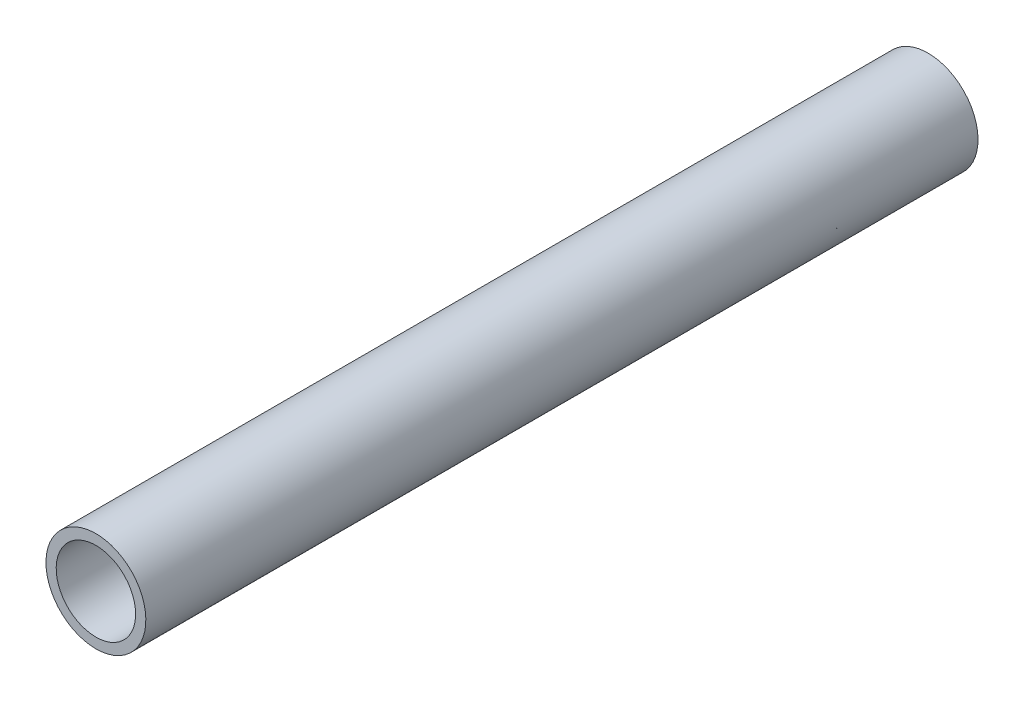
ISO-10303-21;
HEADER;
FILE_DESCRIPTION(('STEP AP214'),'2;1');
FILE_NAME('part.step','',(''),(''),'','','');
FILE_SCHEMA(('AUTOMOTIVE_DESIGN { 1 0 10303 214 1 1 1 1 }'));
ENDSEC;
DATA;
#1=APPLICATION_CONTEXT('core data for automotive mechanical design processes');
#2=APPLICATION_PROTOCOL_DEFINITION('international standard','automotive_design',2000,#1);
#3=PRODUCT_CONTEXT('',#1,'mechanical');
#4=PRODUCT('Part','Part','',(#3));
#5=PRODUCT_RELATED_PRODUCT_CATEGORY('part','',(#4));
#6=PRODUCT_DEFINITION_FORMATION('','',#4);
#7=PRODUCT_DEFINITION_CONTEXT('part definition',#1,'design');
#8=PRODUCT_DEFINITION('design','',#6,#7);
#9=PRODUCT_DEFINITION_SHAPE('','',#8);
#10=(LENGTH_UNIT() NAMED_UNIT(*) SI_UNIT(.MILLI.,.METRE.));
#11=(NAMED_UNIT(*) PLANE_ANGLE_UNIT() SI_UNIT($,.RADIAN.));
#12=(NAMED_UNIT(*) SI_UNIT($,.STERADIAN.) SOLID_ANGLE_UNIT());
#13=UNCERTAINTY_MEASURE_WITH_UNIT(LENGTH_MEASURE(1.E-05),#10,'distance_accuracy_value','');
#14=(GEOMETRIC_REPRESENTATION_CONTEXT(3) GLOBAL_UNCERTAINTY_ASSIGNED_CONTEXT((#13)) GLOBAL_UNIT_ASSIGNED_CONTEXT((#10,
#11,#12)) REPRESENTATION_CONTEXT('',''));
#15=CARTESIAN_POINT('',(0.,0.,0.));
#16=DIRECTION('',(0.,0.,1.));
#17=DIRECTION('',(1.,0.,0.));
#18=AXIS2_PLACEMENT_3D('',#15,#16,#17);
#19=CARTESIAN_POINT('',(0.,0.,0.));
#20=DIRECTION('',(0.,0.,-1.));
#21=DIRECTION('',(0.,-1.,0.));
#22=AXIS2_PLACEMENT_3D('',#19,#20,#21);
#23=CYLINDRICAL_SURFACE('',#22,13.335);
#24=CARTESIAN_POINT('',(0.,0.,-279.4));
#25=DIRECTION('',(0.,0.,1.));
#26=DIRECTION('',(1.,0.,0.));
#27=AXIS2_PLACEMENT_3D('',#24,#25,#26);
#28=CIRCLE('',#27,13.335);
#29=CARTESIAN_POINT('',(13.335,0.,-279.4));
#30=VERTEX_POINT('',#29);
#31=EDGE_CURVE('E25',#30,#30,#28,.T.);
#32=ORIENTED_EDGE('',*,*,#31,.F.);
#33=EDGE_LOOP('',(#32));
#34=FACE_BOUND('',#33,.T.);
#35=CARTESIAN_POINT('',(0.,0.,0.));
#36=DIRECTION('',(0.,0.,-1.));
#37=DIRECTION('',(0.,-1.,0.));
#38=AXIS2_PLACEMENT_3D('',#35,#36,#37);
#39=CIRCLE('',#38,13.335);
#40=CARTESIAN_POINT('',(0.,-13.335,0.));
#41=VERTEX_POINT('',#40);
#42=EDGE_CURVE('E29',#41,#41,#39,.T.);
#43=ORIENTED_EDGE('',*,*,#42,.F.);
#44=EDGE_LOOP('',(#43));
#45=FACE_BOUND('',#44,.T.);
#46=ADVANCED_FACE('F14',(#34,#45),#23,.F.);
#47=CARTESIAN_POINT('',(0.,0.,0.));
#48=DIRECTION('',(0.,0.,-1.));
#49=DIRECTION('',(0.,-1.,0.));
#50=AXIS2_PLACEMENT_3D('',#47,#48,#49);
#51=CYLINDRICAL_SURFACE('',#50,16.764);
#52=CARTESIAN_POINT('',(0.,0.,-279.4));
#53=DIRECTION('',(0.,0.,-1.));
#54=DIRECTION('',(0.,-1.,0.));
#55=AXIS2_PLACEMENT_3D('',#52,#53,#54);
#56=CIRCLE('',#55,16.764);
#57=CARTESIAN_POINT('',(0.,-16.764,-279.4));
#58=VERTEX_POINT('',#57);
#59=EDGE_CURVE('E21',#58,#58,#56,.T.);
#60=ORIENTED_EDGE('',*,*,#59,.F.);
#61=EDGE_LOOP('',(#60));
#62=FACE_BOUND('',#61,.T.);
#63=CARTESIAN_POINT('',(0.,0.,0.));
#64=DIRECTION('',(0.,0.,-1.));
#65=DIRECTION('',(0.,-1.,0.));
#66=AXIS2_PLACEMENT_3D('',#63,#64,#65);
#67=CIRCLE('',#66,16.764);
#68=CARTESIAN_POINT('',(0.,-16.764,0.));
#69=VERTEX_POINT('',#68);
#70=EDGE_CURVE('E9',#69,#69,#67,.T.);
#71=ORIENTED_EDGE('',*,*,#70,.T.);
#72=EDGE_LOOP('',(#71));
#73=FACE_BOUND('',#72,.T.);
#74=ADVANCED_FACE('F16',(#62,#73),#51,.T.);
#75=CARTESIAN_POINT('',(0.,0.,-279.4));
#76=DIRECTION('',(0.,0.,1.));
#77=DIRECTION('',(1.,0.,0.));
#78=AXIS2_PLACEMENT_3D('',#75,#76,#77);
#79=PLANE('',#78);
#80=ORIENTED_EDGE('',*,*,#59,.T.);
#81=EDGE_LOOP('',(#80));
#82=FACE_BOUND('',#81,.T.);
#83=ORIENTED_EDGE('',*,*,#31,.T.);
#84=EDGE_LOOP('',(#83));
#85=FACE_BOUND('',#84,.T.);
#86=ADVANCED_FACE('F43',(#82,#85),#79,.F.);
#87=CARTESIAN_POINT('',(0.,0.,0.));
#88=DIRECTION('',(0.,0.,1.));
#89=DIRECTION('',(1.,0.,0.));
#90=AXIS2_PLACEMENT_3D('',#87,#88,#89);
#91=PLANE('',#90);
#92=ORIENTED_EDGE('',*,*,#70,.F.);
#93=EDGE_LOOP('',(#92));
#94=FACE_BOUND('',#93,.T.);
#95=ORIENTED_EDGE('',*,*,#42,.T.);
#96=EDGE_LOOP('',(#95));
#97=FACE_BOUND('',#96,.T.);
#98=ADVANCED_FACE('F35',(#94,#97),#91,.T.);
#99=CLOSED_SHELL('',(#46,#74,#86,#98));
#100=MANIFOLD_SOLID_BREP('B1',#99);
#101=ADVANCED_BREP_SHAPE_REPRESENTATION('',(#18,#100),#14);
#102=SHAPE_DEFINITION_REPRESENTATION(#9,#101);
ENDSEC;
END-ISO-10303-21;
